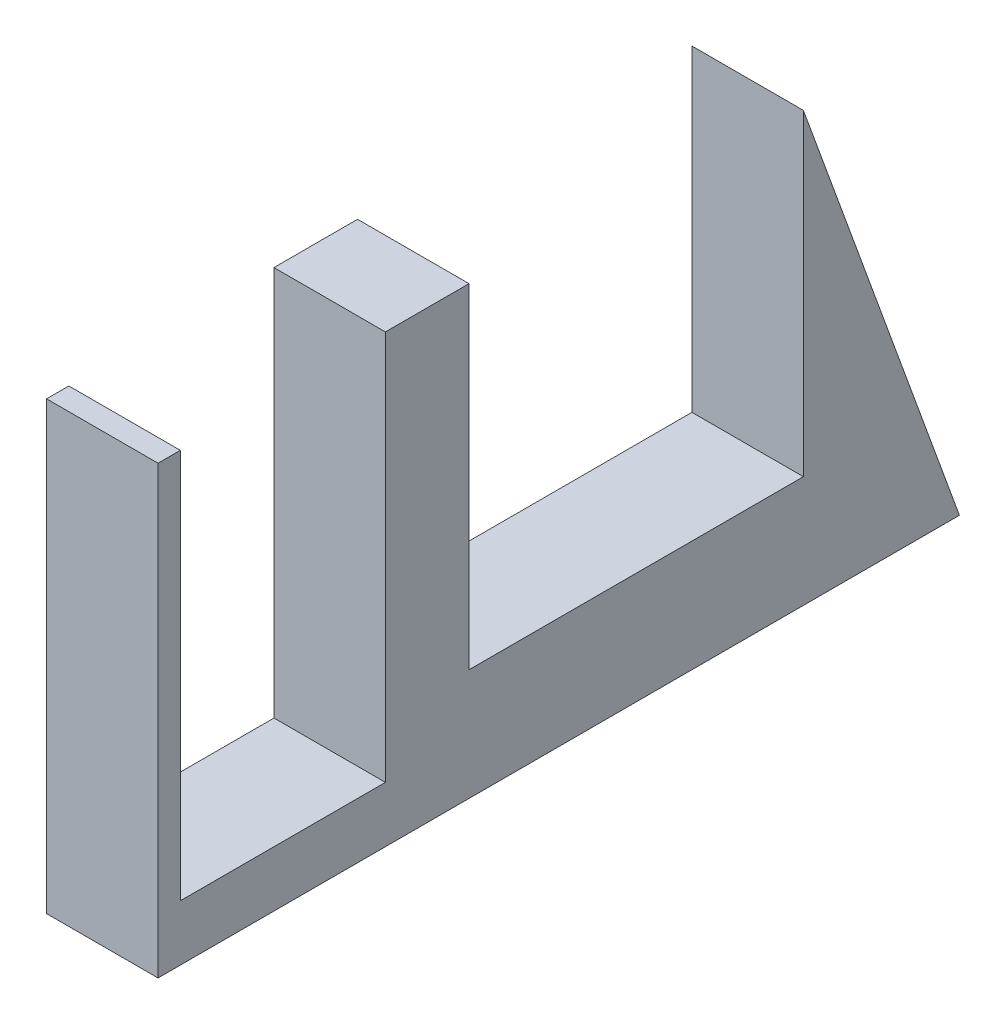
ISO-10303-21;
HEADER;
FILE_DESCRIPTION(('STEP AP214'),'2;1');
FILE_NAME('part.step','',(''),(''),'','','');
FILE_SCHEMA(('AUTOMOTIVE_DESIGN { 1 0 10303 214 1 1 1 1 }'));
ENDSEC;
DATA;
#1=APPLICATION_CONTEXT('core data for automotive mechanical design processes');
#2=APPLICATION_PROTOCOL_DEFINITION('international standard','automotive_design',2000,#1);
#3=PRODUCT_CONTEXT('',#1,'mechanical');
#4=PRODUCT('Part','Part','',(#3));
#5=PRODUCT_RELATED_PRODUCT_CATEGORY('part','',(#4));
#6=PRODUCT_DEFINITION_FORMATION('','',#4);
#7=PRODUCT_DEFINITION_CONTEXT('part definition',#1,'design');
#8=PRODUCT_DEFINITION('design','',#6,#7);
#9=PRODUCT_DEFINITION_SHAPE('','',#8);
#10=(LENGTH_UNIT() NAMED_UNIT(*) SI_UNIT(.MILLI.,.METRE.));
#11=(NAMED_UNIT(*) PLANE_ANGLE_UNIT() SI_UNIT($,.RADIAN.));
#12=(NAMED_UNIT(*) SI_UNIT($,.STERADIAN.) SOLID_ANGLE_UNIT());
#13=UNCERTAINTY_MEASURE_WITH_UNIT(LENGTH_MEASURE(1.E-05),#10,'distance_accuracy_value','');
#14=(GEOMETRIC_REPRESENTATION_CONTEXT(3) GLOBAL_UNCERTAINTY_ASSIGNED_CONTEXT((#13)) GLOBAL_UNIT_ASSIGNED_CONTEXT((#10,
#11,#12)) REPRESENTATION_CONTEXT('',''));
#15=CARTESIAN_POINT('',(0.,0.,0.));
#16=DIRECTION('',(0.,0.,1.));
#17=DIRECTION('',(1.,0.,0.));
#18=AXIS2_PLACEMENT_3D('',#15,#16,#17);
#19=CARTESIAN_POINT('',(12.7,50.8,45.6565));
#20=DIRECTION('',(0.,0.,-1.));
#21=DIRECTION('',(0.,1.,0.));
#22=AXIS2_PLACEMENT_3D('',#19,#20,#21);
#23=PLANE('',#22);
#24=DIRECTION('',(0.,-1.,0.));
#25=VECTOR('',#24,1.);
#26=CARTESIAN_POINT('',(0.,50.8,45.6565));
#27=LINE('',#26,#25);
#28=CARTESIAN_POINT('',(0.,50.8,45.6565));
#29=VERTEX_POINT('',#28);
#30=CARTESIAN_POINT('',(0.,0.,45.6565));
#31=VERTEX_POINT('',#30);
#32=EDGE_CURVE('E146',#29,#31,#27,.T.);
#33=ORIENTED_EDGE('',*,*,#32,.T.);
#34=DIRECTION('',(-1.,0.,0.));
#35=VECTOR('',#34,1.);
#36=CARTESIAN_POINT('',(12.7,0.,45.6565));
#37=LINE('',#36,#35);
#38=CARTESIAN_POINT('',(12.7,0.,45.6565));
#39=VERTEX_POINT('',#38);
#40=EDGE_CURVE('E11',#39,#31,#37,.T.);
#41=ORIENTED_EDGE('',*,*,#40,.F.);
#42=DIRECTION('',(0.,-1.,0.));
#43=VECTOR('',#42,1.);
#44=CARTESIAN_POINT('',(12.7,50.8,45.6565));
#45=LINE('',#44,#43);
#46=CARTESIAN_POINT('',(12.7,50.8,45.6565));
#47=VERTEX_POINT('',#46);
#48=EDGE_CURVE('E166',#47,#39,#45,.T.);
#49=ORIENTED_EDGE('',*,*,#48,.F.);
#50=DIRECTION('',(-1.,0.,0.));
#51=VECTOR('',#50,1.);
#52=CARTESIAN_POINT('',(12.7,50.8,45.6565));
#53=LINE('',#52,#51);
#54=EDGE_CURVE('E142',#47,#29,#53,.T.);
#55=ORIENTED_EDGE('',*,*,#54,.T.);
#56=EDGE_LOOP('',(#33,#41,#49,#55));
#57=FACE_BOUND('',#56,.T.);
#58=ADVANCED_FACE('F32',(#57),#23,.F.);
#59=CARTESIAN_POINT('',(12.7,0.,45.6565));
#60=DIRECTION('',(0.,1.,0.));
#61=DIRECTION('',(0.,0.,1.));
#62=AXIS2_PLACEMENT_3D('',#59,#60,#61);
#63=PLANE('',#62);
#64=DIRECTION('',(0.,0.,-1.));
#65=VECTOR('',#64,1.);
#66=CARTESIAN_POINT('',(0.,0.,45.6565));
#67=LINE('',#66,#65);
#68=CARTESIAN_POINT('',(0.,0.,-45.6565));
#69=VERTEX_POINT('',#68);
#70=EDGE_CURVE('E149',#31,#69,#67,.T.);
#71=ORIENTED_EDGE('',*,*,#70,.T.);
#72=DIRECTION('',(-1.,0.,0.));
#73=VECTOR('',#72,1.);
#74=CARTESIAN_POINT('',(12.7,0.,-45.6565));
#75=LINE('',#74,#73);
#76=CARTESIAN_POINT('',(12.7,0.,-45.6565));
#77=VERTEX_POINT('',#76);
#78=EDGE_CURVE('E40',#77,#69,#75,.T.);
#79=ORIENTED_EDGE('',*,*,#78,.F.);
#80=DIRECTION('',(0.,0.,-1.));
#81=VECTOR('',#80,1.);
#82=CARTESIAN_POINT('',(12.7,0.,45.6565));
#83=LINE('',#82,#81);
#84=EDGE_CURVE('E100',#39,#77,#83,.T.);
#85=ORIENTED_EDGE('',*,*,#84,.F.);
#86=ORIENTED_EDGE('',*,*,#40,.T.);
#87=EDGE_LOOP('',(#71,#79,#85,#86));
#88=FACE_BOUND('',#87,.T.);
#89=ADVANCED_FACE('F238',(#88),#63,.F.);
#90=CARTESIAN_POINT('',(12.7,0.,-45.6565));
#91=DIRECTION('',(0.,-0.342020143325673,0.939692620785907));
#92=DIRECTION('',(0.,-0.939692620785907,-0.342020143325673));
#93=AXIS2_PLACEMENT_3D('',#90,#91,#92);
#94=PLANE('',#93);
#95=DIRECTION('',(0.,0.939692620785907,0.342020143325673));
#96=VECTOR('',#95,1.);
#97=CARTESIAN_POINT('',(0.,0.,-45.6565));
#98=LINE('',#97,#96);
#99=CARTESIAN_POINT('',(0.,48.8501485179026,-27.8765));
#100=VERTEX_POINT('',#99);
#101=EDGE_CURVE('E151',#69,#100,#98,.T.);
#102=ORIENTED_EDGE('',*,*,#101,.T.);
#103=DIRECTION('',(-1.,0.,0.));
#104=VECTOR('',#103,1.);
#105=CARTESIAN_POINT('',(12.7,48.8501485179026,-27.8765));
#106=LINE('',#105,#104);
#107=CARTESIAN_POINT('',(12.7,48.8501485179026,-27.8765));
#108=VERTEX_POINT('',#107);
#109=EDGE_CURVE('E182',#108,#100,#106,.T.);
#110=ORIENTED_EDGE('',*,*,#109,.F.);
#111=DIRECTION('',(0.,0.939692620785907,0.342020143325673));
#112=VECTOR('',#111,1.);
#113=CARTESIAN_POINT('',(12.7,0.,-45.6565));
#114=LINE('',#113,#112);
#115=EDGE_CURVE('E190',#77,#108,#114,.T.);
#116=ORIENTED_EDGE('',*,*,#115,.F.);
#117=ORIENTED_EDGE('',*,*,#78,.T.);
#118=EDGE_LOOP('',(#102,#110,#116,#117));
#119=FACE_BOUND('',#118,.T.);
#120=ADVANCED_FACE('F188',(#119),#94,.F.);
#121=CARTESIAN_POINT('',(12.7,48.8501485179026,-27.8765));
#122=DIRECTION('',(0.,0.,-1.));
#123=DIRECTION('',(0.,1.,0.));
#124=AXIS2_PLACEMENT_3D('',#121,#122,#123);
#125=PLANE('',#124);
#126=DIRECTION('',(0.,-1.,0.));
#127=VECTOR('',#126,1.);
#128=CARTESIAN_POINT('',(0.,48.8501485179026,-27.8765));
#129=LINE('',#128,#127);
#130=CARTESIAN_POINT('',(0.,12.7,-27.8765));
#131=VERTEX_POINT('',#130);
#132=EDGE_CURVE('E153',#100,#131,#129,.T.);
#133=ORIENTED_EDGE('',*,*,#132,.T.);
#134=DIRECTION('',(-1.,0.,0.));
#135=VECTOR('',#134,1.);
#136=CARTESIAN_POINT('',(12.7,12.7,-27.8765));
#137=LINE('',#136,#135);
#138=CARTESIAN_POINT('',(12.7,12.7,-27.8765));
#139=VERTEX_POINT('',#138);
#140=EDGE_CURVE('E179',#139,#131,#137,.T.);
#141=ORIENTED_EDGE('',*,*,#140,.F.);
#142=DIRECTION('',(0.,-1.,0.));
#143=VECTOR('',#142,1.);
#144=CARTESIAN_POINT('',(12.7,48.8501485179026,-27.8765));
#145=LINE('',#144,#143);
#146=EDGE_CURVE('E208',#108,#139,#145,.T.);
#147=ORIENTED_EDGE('',*,*,#146,.F.);
#148=ORIENTED_EDGE('',*,*,#109,.T.);
#149=EDGE_LOOP('',(#133,#141,#147,#148));
#150=FACE_BOUND('',#149,.T.);
#151=ADVANCED_FACE('F199',(#150),#125,.F.);
#152=CARTESIAN_POINT('',(12.7,12.7,-27.8765));
#153=DIRECTION('',(0.,-1.,0.));
#154=DIRECTION('',(0.,0.,-1.));
#155=AXIS2_PLACEMENT_3D('',#152,#153,#154);
#156=PLANE('',#155);
#157=DIRECTION('',(0.,0.,1.));
#158=VECTOR('',#157,1.);
#159=CARTESIAN_POINT('',(0.,12.7,-27.8765));
#160=LINE('',#159,#158);
#161=CARTESIAN_POINT('',(0.,12.7,10.2235));
#162=VERTEX_POINT('',#161);
#163=EDGE_CURVE('E155',#131,#162,#160,.T.);
#164=ORIENTED_EDGE('',*,*,#163,.T.);
#165=DIRECTION('',(-1.,0.,0.));
#166=VECTOR('',#165,1.);
#167=CARTESIAN_POINT('',(12.7,12.7,10.2235));
#168=LINE('',#167,#166);
#169=CARTESIAN_POINT('',(12.7,12.7,10.2235));
#170=VERTEX_POINT('',#169);
#171=EDGE_CURVE('E176',#170,#162,#168,.T.);
#172=ORIENTED_EDGE('',*,*,#171,.F.);
#173=DIRECTION('',(0.,0.,1.));
#174=VECTOR('',#173,1.);
#175=CARTESIAN_POINT('',(12.7,12.7,-27.8765));
#176=LINE('',#175,#174);
#177=EDGE_CURVE('E205',#139,#170,#176,.T.);
#178=ORIENTED_EDGE('',*,*,#177,.F.);
#179=ORIENTED_EDGE('',*,*,#140,.T.);
#180=EDGE_LOOP('',(#164,#172,#178,#179));
#181=FACE_BOUND('',#180,.T.);
#182=ADVANCED_FACE('F203',(#181),#156,.F.);
#183=CARTESIAN_POINT('',(12.7,12.7,10.2235));
#184=DIRECTION('',(0.,0.,1.));
#185=DIRECTION('',(0.,-1.,0.));
#186=AXIS2_PLACEMENT_3D('',#183,#184,#185);
#187=PLANE('',#186);
#188=DIRECTION('',(0.,1.,0.));
#189=VECTOR('',#188,1.);
#190=CARTESIAN_POINT('',(0.,12.7,10.2235));
#191=LINE('',#190,#189);
#192=CARTESIAN_POINT('',(0.,50.8,10.2235));
#193=VERTEX_POINT('',#192);
#194=EDGE_CURVE('E157',#162,#193,#191,.T.);
#195=ORIENTED_EDGE('',*,*,#194,.T.);
#196=DIRECTION('',(-1.,0.,0.));
#197=VECTOR('',#196,1.);
#198=CARTESIAN_POINT('',(12.7,50.8,10.2235));
#199=LINE('',#198,#197);
#200=CARTESIAN_POINT('',(12.7,50.8,10.2235));
#201=VERTEX_POINT('',#200);
#202=EDGE_CURVE('E173',#201,#193,#199,.T.);
#203=ORIENTED_EDGE('',*,*,#202,.F.);
#204=DIRECTION('',(0.,1.,0.));
#205=VECTOR('',#204,1.);
#206=CARTESIAN_POINT('',(12.7,12.7,10.2235));
#207=LINE('',#206,#205);
#208=EDGE_CURVE('E207',#170,#201,#207,.T.);
#209=ORIENTED_EDGE('',*,*,#208,.F.);
#210=ORIENTED_EDGE('',*,*,#171,.T.);
#211=EDGE_LOOP('',(#195,#203,#209,#210));
#212=FACE_BOUND('',#211,.T.);
#213=ADVANCED_FACE('F251',(#212),#187,.F.);
#214=CARTESIAN_POINT('',(12.7,50.8,19.7485));
#215=DIRECTION('',(0.,-1.,0.));
#216=DIRECTION('',(0.,0.,-1.));
#217=AXIS2_PLACEMENT_3D('',#214,#215,#216);
#218=PLANE('',#217);
#219=DIRECTION('',(0.,0.,1.));
#220=VECTOR('',#219,1.);
#221=CARTESIAN_POINT('',(0.,50.8,19.7485));
#222=LINE('',#221,#220);
#223=CARTESIAN_POINT('',(0.,50.8,19.7485));
#224=VERTEX_POINT('',#223);
#225=EDGE_CURVE('E159',#193,#224,#222,.T.);
#226=ORIENTED_EDGE('',*,*,#225,.T.);
#227=DIRECTION('',(-1.,0.,0.));
#228=VECTOR('',#227,1.);
#229=CARTESIAN_POINT('',(12.7,50.8,19.7485));
#230=LINE('',#229,#228);
#231=CARTESIAN_POINT('',(12.7,50.8,19.7485));
#232=VERTEX_POINT('',#231);
#233=EDGE_CURVE('E170',#232,#224,#230,.T.);
#234=ORIENTED_EDGE('',*,*,#233,.F.);
#235=DIRECTION('',(0.,0.,1.));
#236=VECTOR('',#235,1.);
#237=CARTESIAN_POINT('',(12.7,50.8,19.7485));
#238=LINE('',#237,#236);
#239=EDGE_CURVE('E210',#201,#232,#238,.T.);
#240=ORIENTED_EDGE('',*,*,#239,.F.);
#241=ORIENTED_EDGE('',*,*,#202,.T.);
#242=EDGE_LOOP('',(#226,#234,#240,#241));
#243=FACE_BOUND('',#242,.T.);
#244=ADVANCED_FACE('F219',(#243),#218,.F.);
#245=CARTESIAN_POINT('',(12.7,50.8,19.7485));
#246=DIRECTION('',(0.,0.,-1.));
#247=DIRECTION('',(0.,1.,0.));
#248=AXIS2_PLACEMENT_3D('',#245,#246,#247);
#249=PLANE('',#248);
#250=DIRECTION('',(0.,-1.,0.));
#251=VECTOR('',#250,1.);
#252=CARTESIAN_POINT('',(0.,50.8,19.7485));
#253=LINE('',#252,#251);
#254=CARTESIAN_POINT('',(0.,6.35,19.7485));
#255=VERTEX_POINT('',#254);
#256=EDGE_CURVE('E161',#224,#255,#253,.T.);
#257=ORIENTED_EDGE('',*,*,#256,.T.);
#258=DIRECTION('',(-1.,0.,0.));
#259=VECTOR('',#258,1.);
#260=CARTESIAN_POINT('',(12.7,6.35,19.7485));
#261=LINE('',#260,#259);
#262=CARTESIAN_POINT('',(12.7,6.35,19.7485));
#263=VERTEX_POINT('',#262);
#264=EDGE_CURVE('E137',#263,#255,#261,.T.);
#265=ORIENTED_EDGE('',*,*,#264,.F.);
#266=DIRECTION('',(0.,-1.,0.));
#267=VECTOR('',#266,1.);
#268=CARTESIAN_POINT('',(12.7,50.8,19.7485));
#269=LINE('',#268,#267);
#270=EDGE_CURVE('E128',#232,#263,#269,.T.);
#271=ORIENTED_EDGE('',*,*,#270,.F.);
#272=ORIENTED_EDGE('',*,*,#233,.T.);
#273=EDGE_LOOP('',(#257,#265,#271,#272));
#274=FACE_BOUND('',#273,.T.);
#275=ADVANCED_FACE('F223',(#274),#249,.F.);
#276=CARTESIAN_POINT('',(12.7,6.35,43.1165));
#277=DIRECTION('',(0.,-1.,0.));
#278=DIRECTION('',(0.,0.,-1.));
#279=AXIS2_PLACEMENT_3D('',#276,#277,#278);
#280=PLANE('',#279);
#281=DIRECTION('',(0.,0.,1.));
#282=VECTOR('',#281,1.);
#283=CARTESIAN_POINT('',(0.,6.35,43.1165));
#284=LINE('',#283,#282);
#285=CARTESIAN_POINT('',(0.,6.35,43.1165));
#286=VERTEX_POINT('',#285);
#287=EDGE_CURVE('E136',#255,#286,#284,.T.);
#288=ORIENTED_EDGE('',*,*,#287,.T.);
#289=DIRECTION('',(-1.,0.,0.));
#290=VECTOR('',#289,1.);
#291=CARTESIAN_POINT('',(12.7,6.35,43.1165));
#292=LINE('',#291,#290);
#293=CARTESIAN_POINT('',(12.7,6.35,43.1165));
#294=VERTEX_POINT('',#293);
#295=EDGE_CURVE('E133',#294,#286,#292,.T.);
#296=ORIENTED_EDGE('',*,*,#295,.F.);
#297=DIRECTION('',(0.,0.,1.));
#298=VECTOR('',#297,1.);
#299=CARTESIAN_POINT('',(12.7,6.35,43.1165));
#300=LINE('',#299,#298);
#301=EDGE_CURVE('E122',#263,#294,#300,.T.);
#302=ORIENTED_EDGE('',*,*,#301,.F.);
#303=ORIENTED_EDGE('',*,*,#264,.T.);
#304=EDGE_LOOP('',(#288,#296,#302,#303));
#305=FACE_BOUND('',#304,.T.);
#306=ADVANCED_FACE('F134',(#305),#280,.F.);
#307=CARTESIAN_POINT('',(12.7,50.8,43.1165));
#308=DIRECTION('',(0.,0.,1.));
#309=DIRECTION('',(0.,-1.,0.));
#310=AXIS2_PLACEMENT_3D('',#307,#308,#309);
#311=PLANE('',#310);
#312=DIRECTION('',(0.,1.,0.));
#313=VECTOR('',#312,1.);
#314=CARTESIAN_POINT('',(0.,50.8,43.1165));
#315=LINE('',#314,#313);
#316=CARTESIAN_POINT('',(0.,50.8,43.1165));
#317=VERTEX_POINT('',#316);
#318=EDGE_CURVE('E86',#286,#317,#315,.T.);
#319=ORIENTED_EDGE('',*,*,#318,.T.);
#320=DIRECTION('',(-1.,0.,0.));
#321=VECTOR('',#320,1.);
#322=CARTESIAN_POINT('',(12.7,50.8,43.1165));
#323=LINE('',#322,#321);
#324=CARTESIAN_POINT('',(12.7,50.8,43.1165));
#325=VERTEX_POINT('',#324);
#326=EDGE_CURVE('E138',#325,#317,#323,.T.);
#327=ORIENTED_EDGE('',*,*,#326,.F.);
#328=DIRECTION('',(0.,1.,0.));
#329=VECTOR('',#328,1.);
#330=CARTESIAN_POINT('',(12.7,50.8,43.1165));
#331=LINE('',#330,#329);
#332=EDGE_CURVE('E126',#294,#325,#331,.T.);
#333=ORIENTED_EDGE('',*,*,#332,.F.);
#334=ORIENTED_EDGE('',*,*,#295,.T.);
#335=EDGE_LOOP('',(#319,#327,#333,#334));
#336=FACE_BOUND('',#335,.T.);
#337=ADVANCED_FACE('F140',(#336),#311,.F.);
#338=CARTESIAN_POINT('',(12.7,50.8,43.1165));
#339=DIRECTION('',(0.,-1.,0.));
#340=DIRECTION('',(0.,0.,-1.));
#341=AXIS2_PLACEMENT_3D('',#338,#339,#340);
#342=PLANE('',#341);
#343=DIRECTION('',(0.,0.,1.));
#344=VECTOR('',#343,1.);
#345=CARTESIAN_POINT('',(0.,50.8,43.1165));
#346=LINE('',#345,#344);
#347=EDGE_CURVE('E92',#317,#29,#346,.T.);
#348=ORIENTED_EDGE('',*,*,#347,.T.);
#349=ORIENTED_EDGE('',*,*,#54,.F.);
#350=DIRECTION('',(0.,0.,1.));
#351=VECTOR('',#350,1.);
#352=CARTESIAN_POINT('',(12.7,50.8,43.1165));
#353=LINE('',#352,#351);
#354=EDGE_CURVE('E48',#325,#47,#353,.T.);
#355=ORIENTED_EDGE('',*,*,#354,.F.);
#356=ORIENTED_EDGE('',*,*,#326,.T.);
#357=EDGE_LOOP('',(#348,#349,#355,#356));
#358=FACE_BOUND('',#357,.T.);
#359=ADVANCED_FACE('F227',(#358),#342,.F.);
#360=CARTESIAN_POINT('',(12.7,0.,0.));
#361=DIRECTION('',(1.,0.,0.));
#362=DIRECTION('',(0.,0.,-1.));
#363=AXIS2_PLACEMENT_3D('',#360,#361,#362);
#364=PLANE('',#363);
#365=ORIENTED_EDGE('',*,*,#48,.T.);
#366=ORIENTED_EDGE('',*,*,#84,.T.);
#367=ORIENTED_EDGE('',*,*,#115,.T.);
#368=ORIENTED_EDGE('',*,*,#146,.T.);
#369=ORIENTED_EDGE('',*,*,#177,.T.);
#370=ORIENTED_EDGE('',*,*,#208,.T.);
#371=ORIENTED_EDGE('',*,*,#239,.T.);
#372=ORIENTED_EDGE('',*,*,#270,.T.);
#373=ORIENTED_EDGE('',*,*,#301,.T.);
#374=ORIENTED_EDGE('',*,*,#332,.T.);
#375=ORIENTED_EDGE('',*,*,#354,.T.);
#376=EDGE_LOOP('',(#365,#366,#367,#368,#369,#370,#371,#372,#373,#374,#375));
#377=FACE_BOUND('',#376,.T.);
#378=ADVANCED_FACE('F124',(#377),#364,.T.);
#379=CARTESIAN_POINT('',(0.,0.,0.));
#380=DIRECTION('',(1.,0.,0.));
#381=DIRECTION('',(0.,0.,-1.));
#382=AXIS2_PLACEMENT_3D('',#379,#380,#381);
#383=PLANE('',#382);
#384=ORIENTED_EDGE('',*,*,#32,.F.);
#385=ORIENTED_EDGE('',*,*,#347,.F.);
#386=ORIENTED_EDGE('',*,*,#318,.F.);
#387=ORIENTED_EDGE('',*,*,#287,.F.);
#388=ORIENTED_EDGE('',*,*,#256,.F.);
#389=ORIENTED_EDGE('',*,*,#225,.F.);
#390=ORIENTED_EDGE('',*,*,#194,.F.);
#391=ORIENTED_EDGE('',*,*,#163,.F.);
#392=ORIENTED_EDGE('',*,*,#132,.F.);
#393=ORIENTED_EDGE('',*,*,#101,.F.);
#394=ORIENTED_EDGE('',*,*,#70,.F.);
#395=EDGE_LOOP('',(#384,#385,#386,#387,#388,#389,#390,#391,#392,#393,#394));
#396=FACE_BOUND('',#395,.T.);
#397=ADVANCED_FACE('F194',(#396),#383,.F.);
#398=CLOSED_SHELL('',(#58,#89,#120,#151,#182,#213,#244,#275,#306,#337,#359,#378,#397));
#399=MANIFOLD_SOLID_BREP('B2',#398);
#400=ADVANCED_BREP_SHAPE_REPRESENTATION('',(#18,#399),#14);
#401=SHAPE_DEFINITION_REPRESENTATION(#9,#400);
ENDSEC;
END-ISO-10303-21;
